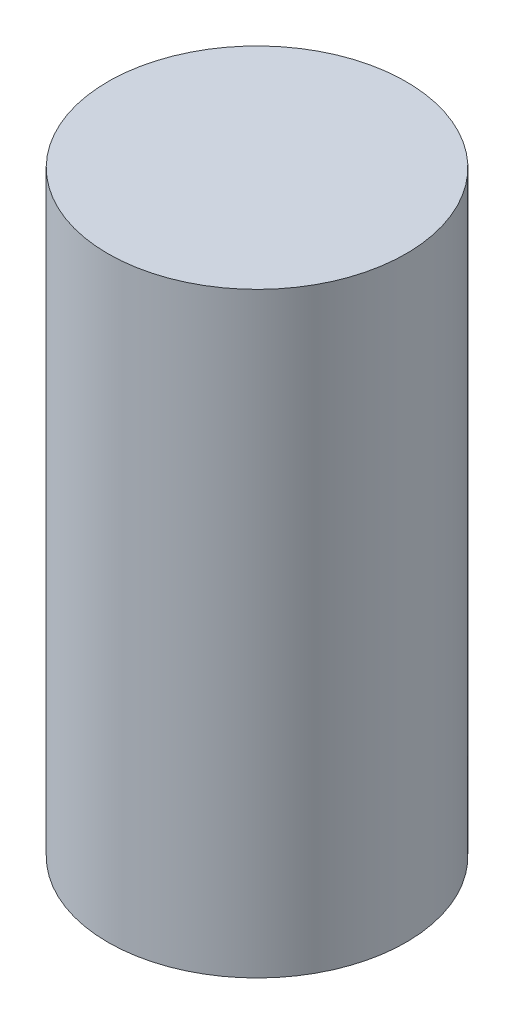
ISO-10303-21;
HEADER;
FILE_DESCRIPTION(('STEP AP214'),'2;1');
FILE_NAME('part.step','',(''),(''),'','','');
FILE_SCHEMA(('AUTOMOTIVE_DESIGN { 1 0 10303 214 1 1 1 1 }'));
ENDSEC;
DATA;
#1=APPLICATION_CONTEXT('core data for automotive mechanical design processes');
#2=APPLICATION_PROTOCOL_DEFINITION('international standard','automotive_design',2000,#1);
#3=PRODUCT_CONTEXT('',#1,'mechanical');
#4=PRODUCT('Part','Part','',(#3));
#5=PRODUCT_RELATED_PRODUCT_CATEGORY('part','',(#4));
#6=PRODUCT_DEFINITION_FORMATION('','',#4);
#7=PRODUCT_DEFINITION_CONTEXT('part definition',#1,'design');
#8=PRODUCT_DEFINITION('design','',#6,#7);
#9=PRODUCT_DEFINITION_SHAPE('','',#8);
#10=(LENGTH_UNIT() NAMED_UNIT(*) SI_UNIT(.MILLI.,.METRE.));
#11=(NAMED_UNIT(*) PLANE_ANGLE_UNIT() SI_UNIT($,.RADIAN.));
#12=(NAMED_UNIT(*) SI_UNIT($,.STERADIAN.) SOLID_ANGLE_UNIT());
#13=UNCERTAINTY_MEASURE_WITH_UNIT(LENGTH_MEASURE(1.E-05),#10,'distance_accuracy_value','');
#14=(GEOMETRIC_REPRESENTATION_CONTEXT(3) GLOBAL_UNCERTAINTY_ASSIGNED_CONTEXT((#13)) GLOBAL_UNIT_ASSIGNED_CONTEXT((#10,
#11,#12)) REPRESENTATION_CONTEXT('',''));
#15=CARTESIAN_POINT('',(0.,0.,0.));
#16=DIRECTION('',(0.,0.,1.));
#17=DIRECTION('',(1.,0.,0.));
#18=AXIS2_PLACEMENT_3D('',#15,#16,#17);
#19=CARTESIAN_POINT('',(0.,6.,0.));
#20=DIRECTION('',(0.,-1.,0.));
#21=DIRECTION('',(0.,0.,-1.));
#22=AXIS2_PLACEMENT_3D('',#19,#20,#21);
#23=CYLINDRICAL_SURFACE('',#22,1.5);
#24=CARTESIAN_POINT('',(0.,6.,0.));
#25=DIRECTION('',(0.,1.,0.));
#26=DIRECTION('',(0.,0.,1.));
#27=AXIS2_PLACEMENT_3D('',#24,#25,#26);
#28=CIRCLE('',#27,1.5);
#29=CARTESIAN_POINT('',(0.,6.,1.5));
#30=VERTEX_POINT('',#29);
#31=EDGE_CURVE('E10',#30,#30,#28,.T.);
#32=ORIENTED_EDGE('',*,*,#31,.F.);
#33=EDGE_LOOP('',(#32));
#34=FACE_BOUND('',#33,.T.);
#35=CARTESIAN_POINT('',(0.,0.,0.));
#36=DIRECTION('',(0.,1.,0.));
#37=DIRECTION('',(0.,0.,1.));
#38=AXIS2_PLACEMENT_3D('',#35,#36,#37);
#39=CIRCLE('',#38,1.5);
#40=CARTESIAN_POINT('',(0.,0.,1.5));
#41=VERTEX_POINT('',#40);
#42=EDGE_CURVE('E36',#41,#41,#39,.T.);
#43=ORIENTED_EDGE('',*,*,#42,.T.);
#44=EDGE_LOOP('',(#43));
#45=FACE_BOUND('',#44,.T.);
#46=ADVANCED_FACE('F33',(#34,#45),#23,.T.);
#47=CARTESIAN_POINT('',(0.,6.,0.));
#48=DIRECTION('',(0.,1.,0.));
#49=DIRECTION('',(0.,0.,1.));
#50=AXIS2_PLACEMENT_3D('',#47,#48,#49);
#51=PLANE('',#50);
#52=ORIENTED_EDGE('',*,*,#31,.T.);
#53=EDGE_LOOP('',(#52));
#54=FACE_BOUND('',#53,.T.);
#55=ADVANCED_FACE('F48',(#54),#51,.T.);
#56=CARTESIAN_POINT('',(0.,0.,0.));
#57=DIRECTION('',(0.,1.,0.));
#58=DIRECTION('',(0.,0.,1.));
#59=AXIS2_PLACEMENT_3D('',#56,#57,#58);
#60=PLANE('',#59);
#61=ORIENTED_EDGE('',*,*,#42,.F.);
#62=EDGE_LOOP('',(#61));
#63=FACE_BOUND('',#62,.T.);
#64=ADVANCED_FACE('F46',(#63),#60,.F.);
#65=CLOSED_SHELL('',(#46,#55,#64));
#66=MANIFOLD_SOLID_BREP('B2',#65);
#67=ADVANCED_BREP_SHAPE_REPRESENTATION('',(#18,#66),#14);
#68=SHAPE_DEFINITION_REPRESENTATION(#9,#67);
ENDSEC;
END-ISO-10303-21;
